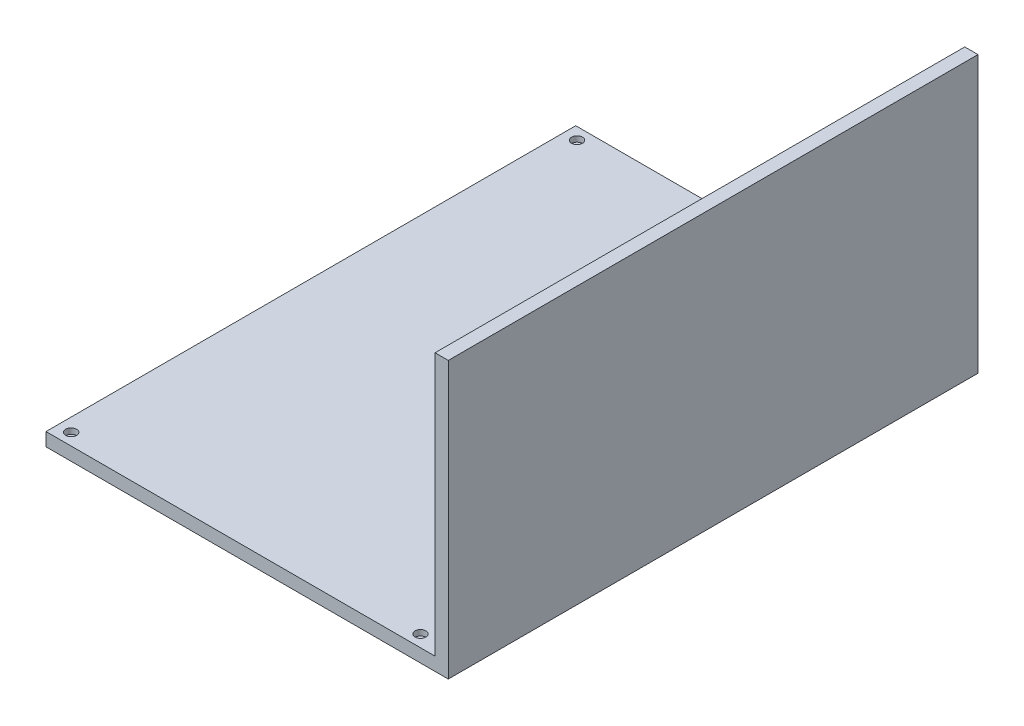
ISO-10303-21;
HEADER;
FILE_DESCRIPTION(('STEP AP214'),'2;1');
FILE_NAME('part.step','',(''),(''),'','','');
FILE_SCHEMA(('AUTOMOTIVE_DESIGN { 1 0 10303 214 1 1 1 1 }'));
ENDSEC;
DATA;
#1=APPLICATION_CONTEXT('core data for automotive mechanical design processes');
#2=APPLICATION_PROTOCOL_DEFINITION('international standard','automotive_design',2000,#1);
#3=PRODUCT_CONTEXT('',#1,'mechanical');
#4=PRODUCT('Part','Part','',(#3));
#5=PRODUCT_RELATED_PRODUCT_CATEGORY('part','',(#4));
#6=PRODUCT_DEFINITION_FORMATION('','',#4);
#7=PRODUCT_DEFINITION_CONTEXT('part definition',#1,'design');
#8=PRODUCT_DEFINITION('design','',#6,#7);
#9=PRODUCT_DEFINITION_SHAPE('','',#8);
#10=(LENGTH_UNIT() NAMED_UNIT(*) SI_UNIT(.MILLI.,.METRE.));
#11=(NAMED_UNIT(*) PLANE_ANGLE_UNIT() SI_UNIT($,.RADIAN.));
#12=(NAMED_UNIT(*) SI_UNIT($,.STERADIAN.) SOLID_ANGLE_UNIT());
#13=UNCERTAINTY_MEASURE_WITH_UNIT(LENGTH_MEASURE(1.E-05),#10,'distance_accuracy_value','');
#14=(GEOMETRIC_REPRESENTATION_CONTEXT(3) GLOBAL_UNCERTAINTY_ASSIGNED_CONTEXT((#13)) GLOBAL_UNIT_ASSIGNED_CONTEXT((#10,
#11,#12)) REPRESENTATION_CONTEXT('',''));
#15=CARTESIAN_POINT('',(0.,0.,0.));
#16=DIRECTION('',(0.,0.,1.));
#17=DIRECTION('',(1.,0.,0.));
#18=AXIS2_PLACEMENT_3D('',#15,#16,#17);
#19=CARTESIAN_POINT('',(0.,0.,200.));
#20=DIRECTION('',(1.,0.,0.));
#21=DIRECTION('',(0.,0.,-1.));
#22=AXIS2_PLACEMENT_3D('',#19,#20,#21);
#23=PLANE('',#22);
#24=DIRECTION('',(0.,-1.,0.));
#25=VECTOR('',#24,1.);
#26=CARTESIAN_POINT('',(0.,0.,0.));
#27=LINE('',#26,#25);
#28=CARTESIAN_POINT('',(0.,0.,0.));
#29=VERTEX_POINT('',#28);
#30=CARTESIAN_POINT('',(0.,-5.,0.));
#31=VERTEX_POINT('',#30);
#32=EDGE_CURVE('E123',#29,#31,#27,.T.);
#33=ORIENTED_EDGE('',*,*,#32,.T.);
#34=DIRECTION('',(0.,0.,-1.));
#35=VECTOR('',#34,1.);
#36=CARTESIAN_POINT('',(0.,-5.,200.));
#37=LINE('',#36,#35);
#38=CARTESIAN_POINT('',(0.,-5.,200.));
#39=VERTEX_POINT('',#38);
#40=EDGE_CURVE('E11',#39,#31,#37,.T.);
#41=ORIENTED_EDGE('',*,*,#40,.F.);
#42=DIRECTION('',(0.,-1.,0.));
#43=VECTOR('',#42,1.);
#44=CARTESIAN_POINT('',(0.,0.,200.));
#45=LINE('',#44,#43);
#46=CARTESIAN_POINT('',(0.,0.,200.));
#47=VERTEX_POINT('',#46);
#48=EDGE_CURVE('E134',#47,#39,#45,.T.);
#49=ORIENTED_EDGE('',*,*,#48,.F.);
#50=DIRECTION('',(0.,0.,-1.));
#51=VECTOR('',#50,1.);
#52=CARTESIAN_POINT('',(0.,0.,200.));
#53=LINE('',#52,#51);
#54=EDGE_CURVE('E119',#47,#29,#53,.T.);
#55=ORIENTED_EDGE('',*,*,#54,.T.);
#56=EDGE_LOOP('',(#33,#41,#49,#55));
#57=FACE_BOUND('',#56,.T.);
#58=ADVANCED_FACE('F39',(#57),#23,.F.);
#59=CARTESIAN_POINT('',(0.,-5.,200.));
#60=DIRECTION('',(0.,1.,0.));
#61=DIRECTION('',(0.,0.,1.));
#62=AXIS2_PLACEMENT_3D('',#59,#60,#61);
#63=PLANE('',#62);
#64=DIRECTION('',(1.,0.,0.));
#65=VECTOR('',#64,1.);
#66=CARTESIAN_POINT('',(0.,-5.,0.));
#67=LINE('',#66,#65);
#68=CARTESIAN_POINT('',(151.881,-5.,0.));
#69=VERTEX_POINT('',#68);
#70=EDGE_CURVE('E126',#31,#69,#67,.T.);
#71=ORIENTED_EDGE('',*,*,#70,.T.);
#72=DIRECTION('',(0.,0.,-1.));
#73=VECTOR('',#72,1.);
#74=CARTESIAN_POINT('',(151.881,-5.,200.));
#75=LINE('',#74,#73);
#76=CARTESIAN_POINT('',(151.881,-5.,200.));
#77=VERTEX_POINT('',#76);
#78=EDGE_CURVE('E47',#77,#69,#75,.T.);
#79=ORIENTED_EDGE('',*,*,#78,.F.);
#80=DIRECTION('',(1.,0.,0.));
#81=VECTOR('',#80,1.);
#82=CARTESIAN_POINT('',(0.,-5.,200.));
#83=LINE('',#82,#81);
#84=EDGE_CURVE('E92',#39,#77,#83,.T.);
#85=ORIENTED_EDGE('',*,*,#84,.F.);
#86=ORIENTED_EDGE('',*,*,#40,.T.);
#87=EDGE_LOOP('',(#71,#79,#85,#86));
#88=FACE_BOUND('',#87,.T.);
#89=ADVANCED_FACE('F162',(#88),#63,.F.);
#90=CARTESIAN_POINT('',(151.881,-5.,200.));
#91=DIRECTION('',(-1.,0.,0.));
#92=DIRECTION('',(0.,0.,1.));
#93=AXIS2_PLACEMENT_3D('',#90,#91,#92);
#94=PLANE('',#93);
#95=DIRECTION('',(0.,1.,0.));
#96=VECTOR('',#95,1.);
#97=CARTESIAN_POINT('',(151.881,-5.,0.));
#98=LINE('',#97,#96);
#99=CARTESIAN_POINT('',(151.881,99.2,0.));
#100=VERTEX_POINT('',#99);
#101=EDGE_CURVE('E129',#69,#100,#98,.T.);
#102=ORIENTED_EDGE('',*,*,#101,.T.);
#103=DIRECTION('',(0.,0.,-1.));
#104=VECTOR('',#103,1.);
#105=CARTESIAN_POINT('',(151.881,99.2,200.));
#106=LINE('',#105,#104);
#107=CARTESIAN_POINT('',(151.881,99.2,200.));
#108=VERTEX_POINT('',#107);
#109=EDGE_CURVE('E114',#108,#100,#106,.T.);
#110=ORIENTED_EDGE('',*,*,#109,.F.);
#111=DIRECTION('',(0.,1.,0.));
#112=VECTOR('',#111,1.);
#113=CARTESIAN_POINT('',(151.881,-5.,200.));
#114=LINE('',#113,#112);
#115=EDGE_CURVE('E105',#77,#108,#114,.T.);
#116=ORIENTED_EDGE('',*,*,#115,.F.);
#117=ORIENTED_EDGE('',*,*,#78,.T.);
#118=EDGE_LOOP('',(#102,#110,#116,#117));
#119=FACE_BOUND('',#118,.T.);
#120=ADVANCED_FACE('F140',(#119),#94,.F.);
#121=CARTESIAN_POINT('',(146.881,99.2,200.));
#122=DIRECTION('',(0.,-1.,0.));
#123=DIRECTION('',(0.,0.,-1.));
#124=AXIS2_PLACEMENT_3D('',#121,#122,#123);
#125=PLANE('',#124);
#126=DIRECTION('',(-1.,0.,0.));
#127=VECTOR('',#126,1.);
#128=CARTESIAN_POINT('',(146.881,99.2,0.));
#129=LINE('',#128,#127);
#130=CARTESIAN_POINT('',(146.881,99.2,0.));
#131=VERTEX_POINT('',#130);
#132=EDGE_CURVE('E113',#100,#131,#129,.T.);
#133=ORIENTED_EDGE('',*,*,#132,.T.);
#134=DIRECTION('',(0.,0.,-1.));
#135=VECTOR('',#134,1.);
#136=CARTESIAN_POINT('',(146.881,99.2,200.));
#137=LINE('',#136,#135);
#138=CARTESIAN_POINT('',(146.881,99.2,200.));
#139=VERTEX_POINT('',#138);
#140=EDGE_CURVE('E110',#139,#131,#137,.T.);
#141=ORIENTED_EDGE('',*,*,#140,.F.);
#142=DIRECTION('',(-1.,0.,0.));
#143=VECTOR('',#142,1.);
#144=CARTESIAN_POINT('',(146.881,99.2,200.));
#145=LINE('',#144,#143);
#146=EDGE_CURVE('E99',#108,#139,#145,.T.);
#147=ORIENTED_EDGE('',*,*,#146,.F.);
#148=ORIENTED_EDGE('',*,*,#109,.T.);
#149=EDGE_LOOP('',(#133,#141,#147,#148));
#150=FACE_BOUND('',#149,.T.);
#151=ADVANCED_FACE('F111',(#150),#125,.F.);
#152=CARTESIAN_POINT('',(146.881,0.,200.));
#153=DIRECTION('',(1.,0.,0.));
#154=DIRECTION('',(0.,0.,-1.));
#155=AXIS2_PLACEMENT_3D('',#152,#153,#154);
#156=PLANE('',#155);
#157=CARTESIAN_POINT('',(146.881,94.7,4.5));
#158=DIRECTION('',(-1.,0.,0.));
#159=DIRECTION('',(0.,0.,1.));
#160=AXIS2_PLACEMENT_3D('',#157,#158,#159);
#161=CIRCLE('',#160,2.05);
#162=CARTESIAN_POINT('',(146.881,94.7,6.55));
#163=VERTEX_POINT('',#162);
#164=EDGE_CURVE('E457',#163,#163,#161,.T.);
#165=ORIENTED_EDGE('',*,*,#164,.F.);
#166=EDGE_LOOP('',(#165));
#167=FACE_BOUND('',#166,.T.);
#168=CARTESIAN_POINT('',(146.881,15.,195.5));
#169=DIRECTION('',(-1.,0.,0.));
#170=DIRECTION('',(0.,0.,-1.));
#171=AXIS2_PLACEMENT_3D('',#168,#169,#170);
#172=CIRCLE('',#171,2.04999999999999);
#173=CARTESIAN_POINT('',(146.881,15.,193.45));
#174=VERTEX_POINT('',#173);
#175=EDGE_CURVE('E463',#174,#174,#172,.T.);
#176=ORIENTED_EDGE('',*,*,#175,.F.);
#177=EDGE_LOOP('',(#176));
#178=FACE_BOUND('',#177,.T.);
#179=CARTESIAN_POINT('',(146.881,94.7,195.5));
#180=DIRECTION('',(-1.,0.,0.));
#181=DIRECTION('',(0.,0.,-1.));
#182=AXIS2_PLACEMENT_3D('',#179,#180,#181);
#183=CIRCLE('',#182,2.04999999999999);
#184=CARTESIAN_POINT('',(146.881,94.7,193.45));
#185=VERTEX_POINT('',#184);
#186=EDGE_CURVE('E464',#185,#185,#183,.T.);
#187=ORIENTED_EDGE('',*,*,#186,.F.);
#188=EDGE_LOOP('',(#187));
#189=FACE_BOUND('',#188,.T.);
#190=CARTESIAN_POINT('',(146.881,15.,4.5));
#191=DIRECTION('',(-1.,0.,0.));
#192=DIRECTION('',(0.,0.,1.));
#193=AXIS2_PLACEMENT_3D('',#190,#191,#192);
#194=CIRCLE('',#193,2.05);
#195=CARTESIAN_POINT('',(146.881,15.,6.55));
#196=VERTEX_POINT('',#195);
#197=EDGE_CURVE('E454',#196,#196,#194,.T.);
#198=ORIENTED_EDGE('',*,*,#197,.F.);
#199=EDGE_LOOP('',(#198));
#200=FACE_BOUND('',#199,.T.);
#201=DIRECTION('',(0.,-1.,0.));
#202=VECTOR('',#201,1.);
#203=CARTESIAN_POINT('',(146.881,0.,0.));
#204=LINE('',#203,#202);
#205=CARTESIAN_POINT('',(146.881,0.,0.));
#206=VERTEX_POINT('',#205);
#207=EDGE_CURVE('E78',#131,#206,#204,.T.);
#208=ORIENTED_EDGE('',*,*,#207,.T.);
#209=DIRECTION('',(0.,0.,-1.));
#210=VECTOR('',#209,1.);
#211=CARTESIAN_POINT('',(146.881,0.,200.));
#212=LINE('',#211,#210);
#213=CARTESIAN_POINT('',(146.881,0.,200.));
#214=VERTEX_POINT('',#213);
#215=EDGE_CURVE('E115',#214,#206,#212,.T.);
#216=ORIENTED_EDGE('',*,*,#215,.F.);
#217=DIRECTION('',(0.,-1.,0.));
#218=VECTOR('',#217,1.);
#219=CARTESIAN_POINT('',(146.881,0.,200.));
#220=LINE('',#219,#218);
#221=EDGE_CURVE('E103',#139,#214,#220,.T.);
#222=ORIENTED_EDGE('',*,*,#221,.F.);
#223=ORIENTED_EDGE('',*,*,#140,.T.);
#224=EDGE_LOOP('',(#208,#216,#222,#223));
#225=FACE_BOUND('',#224,.T.);
#226=ADVANCED_FACE('F117',(#167,#178,#189,#200,#225),#156,.F.);
#227=CARTESIAN_POINT('',(0.,0.,200.));
#228=DIRECTION('',(0.,-1.,0.));
#229=DIRECTION('',(0.,0.,-1.));
#230=AXIS2_PLACEMENT_3D('',#227,#228,#229);
#231=PLANE('',#230);
#232=CARTESIAN_POINT('',(5.,0.,4.49999999999998));
#233=DIRECTION('',(0.,1.,0.));
#234=DIRECTION('',(0.,0.,-1.));
#235=AXIS2_PLACEMENT_3D('',#232,#233,#234);
#236=CIRCLE('',#235,2.05);
#237=CARTESIAN_POINT('',(5.,0.,2.44999999999998));
#238=VERTEX_POINT('',#237);
#239=EDGE_CURVE('E442',#238,#238,#236,.T.);
#240=ORIENTED_EDGE('',*,*,#239,.F.);
#241=EDGE_LOOP('',(#240));
#242=FACE_BOUND('',#241,.T.);
#243=CARTESIAN_POINT('',(136.881,0.,4.5));
#244=DIRECTION('',(0.,1.,0.));
#245=DIRECTION('',(0.,0.,-1.));
#246=AXIS2_PLACEMENT_3D('',#243,#244,#245);
#247=CIRCLE('',#246,2.04999999999999);
#248=CARTESIAN_POINT('',(136.881,0.,2.45000000000001));
#249=VERTEX_POINT('',#248);
#250=EDGE_CURVE('E449',#249,#249,#247,.T.);
#251=ORIENTED_EDGE('',*,*,#250,.F.);
#252=EDGE_LOOP('',(#251));
#253=FACE_BOUND('',#252,.T.);
#254=CARTESIAN_POINT('',(136.881,0.,195.5));
#255=DIRECTION('',(0.,1.,0.));
#256=DIRECTION('',(0.,0.,1.));
#257=AXIS2_PLACEMENT_3D('',#254,#255,#256);
#258=CIRCLE('',#257,2.04999999999999);
#259=CARTESIAN_POINT('',(136.881,0.,197.55));
#260=VERTEX_POINT('',#259);
#261=EDGE_CURVE('E430',#260,#260,#258,.T.);
#262=ORIENTED_EDGE('',*,*,#261,.F.);
#263=EDGE_LOOP('',(#262));
#264=FACE_BOUND('',#263,.T.);
#265=CARTESIAN_POINT('',(5.,0.,195.5));
#266=DIRECTION('',(0.,1.,0.));
#267=DIRECTION('',(0.,0.,1.));
#268=AXIS2_PLACEMENT_3D('',#265,#266,#267);
#269=CIRCLE('',#268,2.05);
#270=CARTESIAN_POINT('',(5.,0.,197.55));
#271=VERTEX_POINT('',#270);
#272=EDGE_CURVE('E428',#271,#271,#269,.T.);
#273=ORIENTED_EDGE('',*,*,#272,.F.);
#274=EDGE_LOOP('',(#273));
#275=FACE_BOUND('',#274,.T.);
#276=DIRECTION('',(-1.,0.,0.));
#277=VECTOR('',#276,1.);
#278=CARTESIAN_POINT('',(0.,0.,0.));
#279=LINE('',#278,#277);
#280=EDGE_CURVE('E84',#206,#29,#279,.T.);
#281=ORIENTED_EDGE('',*,*,#280,.T.);
#282=ORIENTED_EDGE('',*,*,#54,.F.);
#283=DIRECTION('',(-1.,0.,0.));
#284=VECTOR('',#283,1.);
#285=CARTESIAN_POINT('',(0.,0.,200.));
#286=LINE('',#285,#284);
#287=EDGE_CURVE('E55',#214,#47,#286,.T.);
#288=ORIENTED_EDGE('',*,*,#287,.F.);
#289=ORIENTED_EDGE('',*,*,#215,.T.);
#290=EDGE_LOOP('',(#281,#282,#288,#289));
#291=FACE_BOUND('',#290,.T.);
#292=ADVANCED_FACE('F147',(#242,#253,#264,#275,#291),#231,.F.);
#293=CARTESIAN_POINT('',(0.,0.,200.));
#294=DIRECTION('',(0.,0.,1.));
#295=DIRECTION('',(1.,0.,0.));
#296=AXIS2_PLACEMENT_3D('',#293,#294,#295);
#297=PLANE('',#296);
#298=ORIENTED_EDGE('',*,*,#48,.T.);
#299=ORIENTED_EDGE('',*,*,#84,.T.);
#300=ORIENTED_EDGE('',*,*,#115,.T.);
#301=ORIENTED_EDGE('',*,*,#146,.T.);
#302=ORIENTED_EDGE('',*,*,#221,.T.);
#303=ORIENTED_EDGE('',*,*,#287,.T.);
#304=EDGE_LOOP('',(#298,#299,#300,#301,#302,#303));
#305=FACE_BOUND('',#304,.T.);
#306=ADVANCED_FACE('F101',(#305),#297,.T.);
#307=CARTESIAN_POINT('',(0.,0.,0.));
#308=DIRECTION('',(0.,0.,1.));
#309=DIRECTION('',(1.,0.,0.));
#310=AXIS2_PLACEMENT_3D('',#307,#308,#309);
#311=PLANE('',#310);
#312=ORIENTED_EDGE('',*,*,#32,.F.);
#313=ORIENTED_EDGE('',*,*,#280,.F.);
#314=ORIENTED_EDGE('',*,*,#207,.F.);
#315=ORIENTED_EDGE('',*,*,#132,.F.);
#316=ORIENTED_EDGE('',*,*,#101,.F.);
#317=ORIENTED_EDGE('',*,*,#70,.F.);
#318=EDGE_LOOP('',(#312,#313,#314,#315,#316,#317));
#319=FACE_BOUND('',#318,.T.);
#320=ADVANCED_FACE('F143',(#319),#311,.F.);
#321=CARTESIAN_POINT('',(5.,-2.1,195.5));
#322=DIRECTION('',(0.,1.,0.));
#323=DIRECTION('',(0.,0.,1.));
#324=AXIS2_PLACEMENT_3D('',#321,#322,#323);
#325=CYLINDRICAL_SURFACE('',#324,2.05);
#326=CARTESIAN_POINT('',(5.,-2.1,195.5));
#327=DIRECTION('',(0.,1.,0.));
#328=DIRECTION('',(0.,0.,1.));
#329=AXIS2_PLACEMENT_3D('',#326,#327,#328);
#330=CIRCLE('',#329,2.05);
#331=CARTESIAN_POINT('',(5.,-2.1,197.55));
#332=VERTEX_POINT('',#331);
#333=EDGE_CURVE('E127',#332,#332,#330,.T.);
#334=ORIENTED_EDGE('',*,*,#333,.F.);
#335=EDGE_LOOP('',(#334));
#336=FACE_BOUND('',#335,.T.);
#337=ORIENTED_EDGE('',*,*,#272,.T.);
#338=EDGE_LOOP('',(#337));
#339=FACE_BOUND('',#338,.T.);
#340=ADVANCED_FACE('F350',(#336,#339),#325,.F.);
#341=CARTESIAN_POINT('',(5.,-2.1,195.5));
#342=DIRECTION('',(0.,1.,0.));
#343=DIRECTION('',(0.,0.,1.));
#344=AXIS2_PLACEMENT_3D('',#341,#342,#343);
#345=PLANE('',#344);
#346=ORIENTED_EDGE('',*,*,#333,.T.);
#347=EDGE_LOOP('',(#346));
#348=FACE_BOUND('',#347,.T.);
#349=ADVANCED_FACE('F340',(#348),#345,.T.);
#350=CARTESIAN_POINT('',(136.881,-2.1,195.5));
#351=DIRECTION('',(0.,1.,0.));
#352=DIRECTION('',(0.,0.,1.));
#353=AXIS2_PLACEMENT_3D('',#350,#351,#352);
#354=CYLINDRICAL_SURFACE('',#353,2.04999999999999);
#355=CARTESIAN_POINT('',(136.881,-2.1,195.5));
#356=DIRECTION('',(0.,1.,0.));
#357=DIRECTION('',(0.,0.,1.));
#358=AXIS2_PLACEMENT_3D('',#355,#356,#357);
#359=CIRCLE('',#358,2.04999999999999);
#360=CARTESIAN_POINT('',(136.881,-2.1,197.55));
#361=VERTEX_POINT('',#360);
#362=EDGE_CURVE('E434',#361,#361,#359,.T.);
#363=ORIENTED_EDGE('',*,*,#362,.F.);
#364=EDGE_LOOP('',(#363));
#365=FACE_BOUND('',#364,.T.);
#366=ORIENTED_EDGE('',*,*,#261,.T.);
#367=EDGE_LOOP('',(#366));
#368=FACE_BOUND('',#367,.T.);
#369=ADVANCED_FACE('F330',(#365,#368),#354,.F.);
#370=CARTESIAN_POINT('',(136.881,-2.1,195.5));
#371=DIRECTION('',(0.,1.,0.));
#372=DIRECTION('',(0.,0.,1.));
#373=AXIS2_PLACEMENT_3D('',#370,#371,#372);
#374=PLANE('',#373);
#375=ORIENTED_EDGE('',*,*,#362,.T.);
#376=EDGE_LOOP('',(#375));
#377=FACE_BOUND('',#376,.T.);
#378=ADVANCED_FACE('F320',(#377),#374,.T.);
#379=CARTESIAN_POINT('',(136.881,-2.1,4.5));
#380=DIRECTION('',(0.,1.,0.));
#381=DIRECTION('',(0.,0.,1.));
#382=AXIS2_PLACEMENT_3D('',#379,#380,#381);
#383=CYLINDRICAL_SURFACE('',#382,2.04999999999999);
#384=CARTESIAN_POINT('',(136.881,-2.1,4.5));
#385=DIRECTION('',(0.,1.,0.));
#386=DIRECTION('',(0.,0.,-1.));
#387=AXIS2_PLACEMENT_3D('',#384,#385,#386);
#388=CIRCLE('',#387,2.04999999999999);
#389=CARTESIAN_POINT('',(136.881,-2.1,2.45000000000001));
#390=VERTEX_POINT('',#389);
#391=EDGE_CURVE('E446',#390,#390,#388,.T.);
#392=ORIENTED_EDGE('',*,*,#391,.F.);
#393=EDGE_LOOP('',(#392));
#394=FACE_BOUND('',#393,.T.);
#395=ORIENTED_EDGE('',*,*,#250,.T.);
#396=EDGE_LOOP('',(#395));
#397=FACE_BOUND('',#396,.T.);
#398=ADVANCED_FACE('F310',(#394,#397),#383,.F.);
#399=CARTESIAN_POINT('',(136.881,-2.1,4.5));
#400=DIRECTION('',(0.,-1.,0.));
#401=DIRECTION('',(0.,0.,-1.));
#402=AXIS2_PLACEMENT_3D('',#399,#400,#401);
#403=PLANE('',#402);
#404=ORIENTED_EDGE('',*,*,#391,.T.);
#405=EDGE_LOOP('',(#404));
#406=FACE_BOUND('',#405,.T.);
#407=ADVANCED_FACE('F301',(#406),#403,.F.);
#408=CARTESIAN_POINT('',(5.,-2.1,4.49999999999998));
#409=DIRECTION('',(0.,1.,0.));
#410=DIRECTION('',(0.,0.,1.));
#411=AXIS2_PLACEMENT_3D('',#408,#409,#410);
#412=CYLINDRICAL_SURFACE('',#411,2.05);
#413=CARTESIAN_POINT('',(5.,-2.1,4.49999999999998));
#414=DIRECTION('',(0.,1.,0.));
#415=DIRECTION('',(0.,0.,-1.));
#416=AXIS2_PLACEMENT_3D('',#413,#414,#415);
#417=CIRCLE('',#416,2.05);
#418=CARTESIAN_POINT('',(5.,-2.1,2.44999999999998));
#419=VERTEX_POINT('',#418);
#420=EDGE_CURVE('E439',#419,#419,#417,.T.);
#421=ORIENTED_EDGE('',*,*,#420,.F.);
#422=EDGE_LOOP('',(#421));
#423=FACE_BOUND('',#422,.T.);
#424=ORIENTED_EDGE('',*,*,#239,.T.);
#425=EDGE_LOOP('',(#424));
#426=FACE_BOUND('',#425,.T.);
#427=ADVANCED_FACE('F292',(#423,#426),#412,.F.);
#428=CARTESIAN_POINT('',(5.,-2.1,4.49999999999998));
#429=DIRECTION('',(0.,-1.,0.));
#430=DIRECTION('',(0.,0.,-1.));
#431=AXIS2_PLACEMENT_3D('',#428,#429,#430);
#432=PLANE('',#431);
#433=ORIENTED_EDGE('',*,*,#420,.T.);
#434=EDGE_LOOP('',(#433));
#435=FACE_BOUND('',#434,.T.);
#436=ADVANCED_FACE('F189',(#435),#432,.F.);
#437=CARTESIAN_POINT('',(148.981,15.,4.5));
#438=DIRECTION('',(-1.,0.,0.));
#439=DIRECTION('',(0.,0.,1.));
#440=AXIS2_PLACEMENT_3D('',#437,#438,#439);
#441=CYLINDRICAL_SURFACE('',#440,2.05);
#442=CARTESIAN_POINT('',(148.981,15.,4.5));
#443=DIRECTION('',(-1.,0.,0.));
#444=DIRECTION('',(0.,0.,1.));
#445=AXIS2_PLACEMENT_3D('',#442,#443,#444);
#446=CIRCLE('',#445,2.05);
#447=CARTESIAN_POINT('',(148.981,15.,6.55));
#448=VERTEX_POINT('',#447);
#449=EDGE_CURVE('E443',#448,#448,#446,.T.);
#450=ORIENTED_EDGE('',*,*,#449,.F.);
#451=EDGE_LOOP('',(#450));
#452=FACE_BOUND('',#451,.T.);
#453=ORIENTED_EDGE('',*,*,#197,.T.);
#454=EDGE_LOOP('',(#453));
#455=FACE_BOUND('',#454,.T.);
#456=ADVANCED_FACE('F194',(#452,#455),#441,.F.);
#457=CARTESIAN_POINT('',(148.981,15.,4.5));
#458=DIRECTION('',(-1.,0.,0.));
#459=DIRECTION('',(0.,0.,1.));
#460=AXIS2_PLACEMENT_3D('',#457,#458,#459);
#461=PLANE('',#460);
#462=ORIENTED_EDGE('',*,*,#449,.T.);
#463=EDGE_LOOP('',(#462));
#464=FACE_BOUND('',#463,.T.);
#465=ADVANCED_FACE('F199',(#464),#461,.T.);
#466=CARTESIAN_POINT('',(148.981,94.7,195.5));
#467=DIRECTION('',(-1.,0.,0.));
#468=DIRECTION('',(0.,0.,1.));
#469=AXIS2_PLACEMENT_3D('',#466,#467,#468);
#470=CYLINDRICAL_SURFACE('',#469,2.04999999999999);
#471=CARTESIAN_POINT('',(148.981,94.7,195.5));
#472=DIRECTION('',(-1.,0.,0.));
#473=DIRECTION('',(0.,0.,-1.));
#474=AXIS2_PLACEMENT_3D('',#471,#472,#473);
#475=CIRCLE('',#474,2.04999999999999);
#476=CARTESIAN_POINT('',(148.981,94.7,193.45));
#477=VERTEX_POINT('',#476);
#478=EDGE_CURVE('E472',#477,#477,#475,.T.);
#479=ORIENTED_EDGE('',*,*,#478,.F.);
#480=EDGE_LOOP('',(#479));
#481=FACE_BOUND('',#480,.T.);
#482=ORIENTED_EDGE('',*,*,#186,.T.);
#483=EDGE_LOOP('',(#482));
#484=FACE_BOUND('',#483,.T.);
#485=ADVANCED_FACE('F210',(#481,#484),#470,.F.);
#486=CARTESIAN_POINT('',(148.981,94.7,195.5));
#487=DIRECTION('',(1.,0.,0.));
#488=DIRECTION('',(0.,0.,-1.));
#489=AXIS2_PLACEMENT_3D('',#486,#487,#488);
#490=PLANE('',#489);
#491=ORIENTED_EDGE('',*,*,#478,.T.);
#492=EDGE_LOOP('',(#491));
#493=FACE_BOUND('',#492,.T.);
#494=ADVANCED_FACE('F221',(#493),#490,.F.);
#495=CARTESIAN_POINT('',(148.981,15.,195.5));
#496=DIRECTION('',(-1.,0.,0.));
#497=DIRECTION('',(0.,0.,1.));
#498=AXIS2_PLACEMENT_3D('',#495,#496,#497);
#499=CYLINDRICAL_SURFACE('',#498,2.04999999999999);
#500=CARTESIAN_POINT('',(148.981,15.,195.5));
#501=DIRECTION('',(-1.,0.,0.));
#502=DIRECTION('',(0.,0.,-1.));
#503=AXIS2_PLACEMENT_3D('',#500,#501,#502);
#504=CIRCLE('',#503,2.04999999999999);
#505=CARTESIAN_POINT('',(148.981,15.,193.45));
#506=VERTEX_POINT('',#505);
#507=EDGE_CURVE('E460',#506,#506,#504,.T.);
#508=ORIENTED_EDGE('',*,*,#507,.F.);
#509=EDGE_LOOP('',(#508));
#510=FACE_BOUND('',#509,.T.);
#511=ORIENTED_EDGE('',*,*,#175,.T.);
#512=EDGE_LOOP('',(#511));
#513=FACE_BOUND('',#512,.T.);
#514=ADVANCED_FACE('F232',(#510,#513),#499,.F.);
#515=CARTESIAN_POINT('',(148.981,15.,195.5));
#516=DIRECTION('',(1.,0.,0.));
#517=DIRECTION('',(0.,0.,-1.));
#518=AXIS2_PLACEMENT_3D('',#515,#516,#517);
#519=PLANE('',#518);
#520=ORIENTED_EDGE('',*,*,#507,.T.);
#521=EDGE_LOOP('',(#520));
#522=FACE_BOUND('',#521,.T.);
#523=ADVANCED_FACE('F243',(#522),#519,.F.);
#524=CARTESIAN_POINT('',(148.981,94.7,4.5));
#525=DIRECTION('',(-1.,0.,0.));
#526=DIRECTION('',(0.,0.,1.));
#527=AXIS2_PLACEMENT_3D('',#524,#525,#526);
#528=CYLINDRICAL_SURFACE('',#527,2.05);
#529=CARTESIAN_POINT('',(148.981,94.7,4.5));
#530=DIRECTION('',(-1.,0.,0.));
#531=DIRECTION('',(0.,0.,1.));
#532=AXIS2_PLACEMENT_3D('',#529,#530,#531);
#533=CIRCLE('',#532,2.05);
#534=CARTESIAN_POINT('',(148.981,94.7,6.55));
#535=VERTEX_POINT('',#534);
#536=EDGE_CURVE('E467',#535,#535,#533,.T.);
#537=ORIENTED_EDGE('',*,*,#536,.F.);
#538=EDGE_LOOP('',(#537));
#539=FACE_BOUND('',#538,.T.);
#540=ORIENTED_EDGE('',*,*,#164,.T.);
#541=EDGE_LOOP('',(#540));
#542=FACE_BOUND('',#541,.T.);
#543=ADVANCED_FACE('F254',(#539,#542),#528,.F.);
#544=CARTESIAN_POINT('',(148.981,94.7,4.5));
#545=DIRECTION('',(-1.,0.,0.));
#546=DIRECTION('',(0.,0.,1.));
#547=AXIS2_PLACEMENT_3D('',#544,#545,#546);
#548=PLANE('',#547);
#549=ORIENTED_EDGE('',*,*,#536,.T.);
#550=EDGE_LOOP('',(#549));
#551=FACE_BOUND('',#550,.T.);
#552=ADVANCED_FACE('F265',(#551),#548,.T.);
#553=CLOSED_SHELL('',(#58,#89,#120,#151,#226,#292,#306,#320,#340,#349,#369,#378,#398,#407,#427,
#436,#456,#465,#485,#494,#514,#523,#543,#552));
#554=MANIFOLD_SOLID_BREP('B2',#553);
#555=ADVANCED_BREP_SHAPE_REPRESENTATION('',(#18,#554),#14);
#556=SHAPE_DEFINITION_REPRESENTATION(#9,#555);
ENDSEC;
END-ISO-10303-21;
